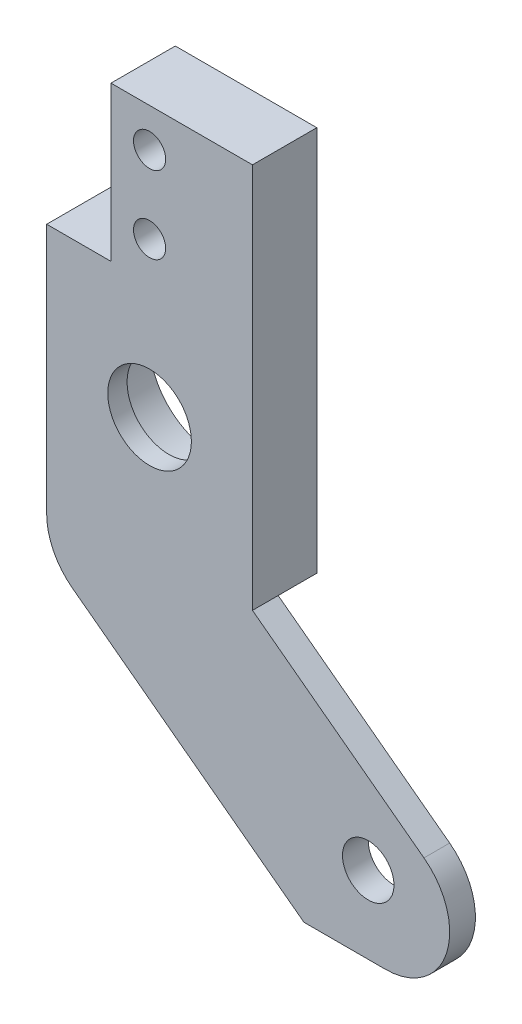
ISO-10303-21;
HEADER;
FILE_DESCRIPTION(('STEP AP214'),'2;1');
FILE_NAME('part.step','',(''),(''),'','','');
FILE_SCHEMA(('AUTOMOTIVE_DESIGN { 1 0 10303 214 1 1 1 1 }'));
ENDSEC;
DATA;
#1=APPLICATION_CONTEXT('core data for automotive mechanical design processes');
#2=APPLICATION_PROTOCOL_DEFINITION('international standard','automotive_design',2000,#1);
#3=PRODUCT_CONTEXT('',#1,'mechanical');
#4=PRODUCT('Part','Part','',(#3));
#5=PRODUCT_RELATED_PRODUCT_CATEGORY('part','',(#4));
#6=PRODUCT_DEFINITION_FORMATION('','',#4);
#7=PRODUCT_DEFINITION_CONTEXT('part definition',#1,'design');
#8=PRODUCT_DEFINITION('design','',#6,#7);
#9=PRODUCT_DEFINITION_SHAPE('','',#8);
#10=(LENGTH_UNIT() NAMED_UNIT(*) SI_UNIT(.MILLI.,.METRE.));
#11=(NAMED_UNIT(*) PLANE_ANGLE_UNIT() SI_UNIT($,.RADIAN.));
#12=(NAMED_UNIT(*) SI_UNIT($,.STERADIAN.) SOLID_ANGLE_UNIT());
#13=UNCERTAINTY_MEASURE_WITH_UNIT(LENGTH_MEASURE(1.E-05),#10,'distance_accuracy_value','');
#14=(GEOMETRIC_REPRESENTATION_CONTEXT(3) GLOBAL_UNCERTAINTY_ASSIGNED_CONTEXT((#13)) GLOBAL_UNIT_ASSIGNED_CONTEXT((#10,
#11,#12)) REPRESENTATION_CONTEXT('',''));
#15=CARTESIAN_POINT('',(0.,0.,0.));
#16=DIRECTION('',(0.,0.,1.));
#17=DIRECTION('',(1.,0.,0.));
#18=AXIS2_PLACEMENT_3D('',#15,#16,#17);
#19=CARTESIAN_POINT('',(8.,21.,5.));
#20=DIRECTION('',(-1.,0.,0.));
#21=DIRECTION('',(0.,-1.,0.));
#22=AXIS2_PLACEMENT_3D('',#19,#20,#21);
#23=PLANE('',#22);
#24=DIRECTION('',(0.,1.,0.));
#25=VECTOR('',#24,1.);
#26=CARTESIAN_POINT('',(8.,21.,0.));
#27=LINE('',#26,#25);
#28=CARTESIAN_POINT('',(8.00000000000001,-9.,0.));
#29=VERTEX_POINT('',#28);
#30=CARTESIAN_POINT('',(8.,21.,0.));
#31=VERTEX_POINT('',#30);
#32=EDGE_CURVE('E218',#29,#31,#27,.T.);
#33=ORIENTED_EDGE('',*,*,#32,.T.);
#34=DIRECTION('',(0.,0.,-1.));
#35=VECTOR('',#34,1.);
#36=CARTESIAN_POINT('',(8.,21.,5.));
#37=LINE('',#36,#35);
#38=CARTESIAN_POINT('',(8.,21.,5.));
#39=VERTEX_POINT('',#38);
#40=EDGE_CURVE('E144',#39,#31,#37,.T.);
#41=ORIENTED_EDGE('',*,*,#40,.F.);
#42=DIRECTION('',(0.,1.,0.));
#43=VECTOR('',#42,1.);
#44=CARTESIAN_POINT('',(8.,21.,5.));
#45=LINE('',#44,#43);
#46=CARTESIAN_POINT('',(8.00000000000001,-9.,5.));
#47=VERTEX_POINT('',#46);
#48=EDGE_CURVE('E221',#47,#39,#45,.T.);
#49=ORIENTED_EDGE('',*,*,#48,.F.);
#50=DIRECTION('',(0.,0.,-1.));
#51=VECTOR('',#50,1.);
#52=CARTESIAN_POINT('',(8.00000000000001,-9.,5.));
#53=LINE('',#52,#51);
#54=CARTESIAN_POINT('',(8.00000000000001,-9.,3.));
#55=VERTEX_POINT('',#54);
#56=EDGE_CURVE('E235',#47,#55,#53,.T.);
#57=ORIENTED_EDGE('',*,*,#56,.T.);
#58=DIRECTION('',(0.,0.,-1.));
#59=VECTOR('',#58,1.);
#60=CARTESIAN_POINT('',(8.00000000000001,-9.,3.));
#61=LINE('',#60,#59);
#62=EDGE_CURVE('E175',#55,#29,#61,.T.);
#63=ORIENTED_EDGE('',*,*,#62,.T.);
#64=EDGE_LOOP('',(#33,#41,#49,#57,#63));
#65=FACE_BOUND('',#64,.T.);
#66=ADVANCED_FACE('F34',(#65),#23,.F.);
#67=CARTESIAN_POINT('',(-8.,21.,5.));
#68=DIRECTION('',(0.,-1.,0.));
#69=DIRECTION('',(0.,0.,-1.));
#70=AXIS2_PLACEMENT_3D('',#67,#68,#69);
#71=PLANE('',#70);
#72=DIRECTION('',(-1.,0.,0.));
#73=VECTOR('',#72,1.);
#74=CARTESIAN_POINT('',(-8.,21.,0.));
#75=LINE('',#74,#73);
#76=CARTESIAN_POINT('',(-3.,21.,0.));
#77=VERTEX_POINT('',#76);
#78=EDGE_CURVE('E238',#31,#77,#75,.T.);
#79=ORIENTED_EDGE('',*,*,#78,.T.);
#80=DIRECTION('',(0.,0.,1.));
#81=VECTOR('',#80,1.);
#82=CARTESIAN_POINT('',(-3.,21.,-13.));
#83=LINE('',#82,#81);
#84=CARTESIAN_POINT('',(-3.,21.,5.));
#85=VERTEX_POINT('',#84);
#86=EDGE_CURVE('E196',#77,#85,#83,.T.);
#87=ORIENTED_EDGE('',*,*,#86,.T.);
#88=DIRECTION('',(-1.,0.,0.));
#89=VECTOR('',#88,1.);
#90=CARTESIAN_POINT('',(-8.,21.,5.));
#91=LINE('',#90,#89);
#92=EDGE_CURVE('E224',#39,#85,#91,.T.);
#93=ORIENTED_EDGE('',*,*,#92,.F.);
#94=ORIENTED_EDGE('',*,*,#40,.T.);
#95=EDGE_LOOP('',(#79,#87,#93,#94));
#96=FACE_BOUND('',#95,.T.);
#97=ADVANCED_FACE('F253',(#96),#71,.F.);
#98=CARTESIAN_POINT('',(-8.,-13.,5.));
#99=DIRECTION('',(1.,0.,0.));
#100=DIRECTION('',(0.,0.,-1.));
#101=AXIS2_PLACEMENT_3D('',#98,#99,#100);
#102=PLANE('',#101);
#103=DIRECTION('',(0.,-1.,0.));
#104=VECTOR('',#103,1.);
#105=CARTESIAN_POINT('',(-8.,-13.,0.));
#106=LINE('',#105,#104);
#107=CARTESIAN_POINT('',(-8.,9.,0.));
#108=VERTEX_POINT('',#107);
#109=CARTESIAN_POINT('',(-8.,-9.,0.));
#110=VERTEX_POINT('',#109);
#111=EDGE_CURVE('E225',#108,#110,#106,.T.);
#112=ORIENTED_EDGE('',*,*,#111,.T.);
#113=DIRECTION('',(0.,0.,-1.));
#114=VECTOR('',#113,1.);
#115=CARTESIAN_POINT('',(-8.,-9.,3.));
#116=LINE('',#115,#114);
#117=CARTESIAN_POINT('',(-8.,-9.,3.));
#118=VERTEX_POINT('',#117);
#119=EDGE_CURVE('E172',#118,#110,#116,.T.);
#120=ORIENTED_EDGE('',*,*,#119,.F.);
#121=DIRECTION('',(0.,1.,0.));
#122=VECTOR('',#121,1.);
#123=CARTESIAN_POINT('',(-8.,-9.,3.));
#124=LINE('',#123,#122);
#125=CARTESIAN_POINT('',(-8.,-10.5,3.));
#126=VERTEX_POINT('',#125);
#127=EDGE_CURVE('E165',#126,#118,#124,.T.);
#128=ORIENTED_EDGE('',*,*,#127,.F.);
#129=DIRECTION('',(0.,0.,-1.));
#130=VECTOR('',#129,1.);
#131=CARTESIAN_POINT('',(-8.,-10.5,5.));
#132=LINE('',#131,#130);
#133=CARTESIAN_POINT('',(-8.,-10.5,5.));
#134=VERTEX_POINT('',#133);
#135=EDGE_CURVE('E11',#126,#134,#132,.F.);
#136=ORIENTED_EDGE('',*,*,#135,.T.);
#137=DIRECTION('',(0.,-1.,0.));
#138=VECTOR('',#137,1.);
#139=CARTESIAN_POINT('',(-8.,-13.,5.));
#140=LINE('',#139,#138);
#141=CARTESIAN_POINT('',(-8.,9.,5.));
#142=VERTEX_POINT('',#141);
#143=EDGE_CURVE('E228',#142,#134,#140,.T.);
#144=ORIENTED_EDGE('',*,*,#143,.F.);
#145=DIRECTION('',(0.,0.,1.));
#146=VECTOR('',#145,1.);
#147=CARTESIAN_POINT('',(-8.,9.,-13.));
#148=LINE('',#147,#146);
#149=EDGE_CURVE('E201',#108,#142,#148,.T.);
#150=ORIENTED_EDGE('',*,*,#149,.F.);
#151=EDGE_LOOP('',(#112,#120,#128,#136,#144,#150));
#152=FACE_BOUND('',#151,.T.);
#153=ADVANCED_FACE('F266',(#152),#102,.F.);
#154=CARTESIAN_POINT('',(-8.,-13.,5.));
#155=DIRECTION('',(0.6,0.8,0.));
#156=DIRECTION('',(-0.8,0.6,0.));
#157=AXIS2_PLACEMENT_3D('',#154,#155,#156);
#158=PLANE('',#157);
#159=DIRECTION('',(0.,0.,-1.));
#160=VECTOR('',#159,1.);
#161=CARTESIAN_POINT('',(-6.,-14.5,5.));
#162=LINE('',#161,#160);
#163=CARTESIAN_POINT('',(-6.,-14.5,5.));
#164=VERTEX_POINT('',#163);
#165=CARTESIAN_POINT('',(-6.,-14.5,3.));
#166=VERTEX_POINT('',#165);
#167=EDGE_CURVE('E42',#164,#166,#162,.T.);
#168=ORIENTED_EDGE('',*,*,#167,.T.);
#169=DIRECTION('',(-0.8,0.6,0.));
#170=VECTOR('',#169,1.);
#171=CARTESIAN_POINT('',(-6.,-14.5,3.));
#172=LINE('',#171,#170);
#173=CARTESIAN_POINT('',(12.,-28.,3.));
#174=VERTEX_POINT('',#173);
#175=EDGE_CURVE('E49',#174,#166,#172,.T.);
#176=ORIENTED_EDGE('',*,*,#175,.F.);
#177=DIRECTION('',(0.,0.,-1.));
#178=VECTOR('',#177,1.);
#179=CARTESIAN_POINT('',(12.,-28.,5.));
#180=LINE('',#179,#178);
#181=CARTESIAN_POINT('',(12.,-28.,5.));
#182=VERTEX_POINT('',#181);
#183=EDGE_CURVE('E148',#182,#174,#180,.T.);
#184=ORIENTED_EDGE('',*,*,#183,.F.);
#185=DIRECTION('',(0.8,-0.6,0.));
#186=VECTOR('',#185,1.);
#187=CARTESIAN_POINT('',(-8.,-13.,5.));
#188=LINE('',#187,#186);
#189=EDGE_CURVE('E160',#164,#182,#188,.T.);
#190=ORIENTED_EDGE('',*,*,#189,.F.);
#191=EDGE_LOOP('',(#168,#176,#184,#190));
#192=FACE_BOUND('',#191,.T.);
#193=ADVANCED_FACE('F157',(#192),#158,.F.);
#194=CARTESIAN_POINT('',(12.,-28.,5.));
#195=DIRECTION('',(0.,1.,0.));
#196=DIRECTION('',(-1.,0.,0.));
#197=AXIS2_PLACEMENT_3D('',#194,#195,#196);
#198=PLANE('',#197);
#199=ORIENTED_EDGE('',*,*,#183,.T.);
#200=DIRECTION('',(-1.,0.,0.));
#201=VECTOR('',#200,1.);
#202=CARTESIAN_POINT('',(12.,-28.,3.));
#203=LINE('',#202,#201);
#204=CARTESIAN_POINT('',(18.3333333333333,-28.,3.));
#205=VERTEX_POINT('',#204);
#206=EDGE_CURVE('E139',#205,#174,#203,.T.);
#207=ORIENTED_EDGE('',*,*,#206,.F.);
#208=DIRECTION('',(0.,0.,-1.));
#209=VECTOR('',#208,1.);
#210=CARTESIAN_POINT('',(18.3333333333333,-28.,5.));
#211=LINE('',#210,#209);
#212=CARTESIAN_POINT('',(18.3333333333333,-28.,5.));
#213=VERTEX_POINT('',#212);
#214=EDGE_CURVE('E138',#205,#213,#211,.F.);
#215=ORIENTED_EDGE('',*,*,#214,.T.);
#216=DIRECTION('',(1.,0.,0.));
#217=VECTOR('',#216,1.);
#218=CARTESIAN_POINT('',(12.,-28.,5.));
#219=LINE('',#218,#217);
#220=EDGE_CURVE('E231',#182,#213,#219,.T.);
#221=ORIENTED_EDGE('',*,*,#220,.F.);
#222=EDGE_LOOP('',(#199,#207,#215,#221));
#223=FACE_BOUND('',#222,.T.);
#224=ADVANCED_FACE('F245',(#223),#198,.F.);
#225=CARTESIAN_POINT('',(33.3333333333334,-28.,5.));
#226=DIRECTION('',(-0.6,-0.8,0.));
#227=DIRECTION('',(0.8,-0.6,0.));
#228=AXIS2_PLACEMENT_3D('',#225,#226,#227);
#229=PLANE('',#228);
#230=DIRECTION('',(0.,0.,-1.));
#231=VECTOR('',#230,1.);
#232=CARTESIAN_POINT('',(21.3333333333333,-19.,5.));
#233=LINE('',#232,#231);
#234=CARTESIAN_POINT('',(21.3333333333333,-19.,5.));
#235=VERTEX_POINT('',#234);
#236=CARTESIAN_POINT('',(21.3333333333333,-19.,3.));
#237=VERTEX_POINT('',#236);
#238=EDGE_CURVE('E137',#235,#237,#233,.T.);
#239=ORIENTED_EDGE('',*,*,#238,.T.);
#240=DIRECTION('',(0.8,-0.6,0.));
#241=VECTOR('',#240,1.);
#242=CARTESIAN_POINT('',(21.3333333333333,-19.,3.));
#243=LINE('',#242,#241);
#244=EDGE_CURVE('E119',#55,#237,#243,.T.);
#245=ORIENTED_EDGE('',*,*,#244,.F.);
#246=ORIENTED_EDGE('',*,*,#56,.F.);
#247=DIRECTION('',(-0.8,0.6,0.));
#248=VECTOR('',#247,1.);
#249=CARTESIAN_POINT('',(33.3333333333334,-28.,5.));
#250=LINE('',#249,#248);
#251=EDGE_CURVE('E143',#235,#47,#250,.T.);
#252=ORIENTED_EDGE('',*,*,#251,.F.);
#253=EDGE_LOOP('',(#239,#245,#246,#252));
#254=FACE_BOUND('',#253,.T.);
#255=ADVANCED_FACE('F142',(#254),#229,.F.);
#256=CARTESIAN_POINT('',(8.00000000000001,-28.,5.));
#257=DIRECTION('',(0.,0.,1.));
#258=DIRECTION('',(1.,0.,0.));
#259=AXIS2_PLACEMENT_3D('',#256,#257,#258);
#260=PLANE('',#259);
#261=CARTESIAN_POINT('',(17.,-22.,5.));
#262=DIRECTION('',(0.,0.,1.));
#263=DIRECTION('',(1.,0.,0.));
#264=AXIS2_PLACEMENT_3D('',#261,#262,#263);
#265=CIRCLE('',#264,2.);
#266=CARTESIAN_POINT('',(19.,-22.,5.));
#267=VERTEX_POINT('',#266);
#268=EDGE_CURVE('E174',#267,#267,#265,.F.);
#269=ORIENTED_EDGE('',*,*,#268,.T.);
#270=EDGE_LOOP('',(#269));
#271=FACE_BOUND('',#270,.T.);
#272=CARTESIAN_POINT('',(0.,12.,5.));
#273=DIRECTION('',(0.,0.,1.));
#274=DIRECTION('',(1.,0.,0.));
#275=AXIS2_PLACEMENT_3D('',#272,#273,#274);
#276=CIRCLE('',#275,1.25);
#277=CARTESIAN_POINT('',(-1.25,12.,5.));
#278=VERTEX_POINT('',#277);
#279=EDGE_CURVE('E182',#278,#278,#276,.F.);
#280=ORIENTED_EDGE('',*,*,#279,.T.);
#281=EDGE_LOOP('',(#280));
#282=FACE_BOUND('',#281,.T.);
#283=CARTESIAN_POINT('',(0.,18.,5.));
#284=DIRECTION('',(0.,0.,1.));
#285=DIRECTION('',(1.,0.,0.));
#286=AXIS2_PLACEMENT_3D('',#283,#284,#285);
#287=CIRCLE('',#286,1.25);
#288=CARTESIAN_POINT('',(-1.25,18.,5.));
#289=VERTEX_POINT('',#288);
#290=EDGE_CURVE('E188',#289,#289,#287,.F.);
#291=ORIENTED_EDGE('',*,*,#290,.T.);
#292=EDGE_LOOP('',(#291));
#293=FACE_BOUND('',#292,.T.);
#294=ORIENTED_EDGE('',*,*,#220,.T.);
#295=CARTESIAN_POINT('',(18.3333333333333,-23.,5.));
#296=DIRECTION('',(0.,0.,1.));
#297=DIRECTION('',(1.,0.,0.));
#298=AXIS2_PLACEMENT_3D('',#295,#296,#297);
#299=CIRCLE('',#298,5.);
#300=EDGE_CURVE('E153',#213,#235,#299,.T.);
#301=ORIENTED_EDGE('',*,*,#300,.T.);
#302=ORIENTED_EDGE('',*,*,#251,.T.);
#303=ORIENTED_EDGE('',*,*,#48,.T.);
#304=ORIENTED_EDGE('',*,*,#92,.T.);
#305=DIRECTION('',(0.,1.,0.));
#306=VECTOR('',#305,1.);
#307=CARTESIAN_POINT('',(-3.,21.,5.));
#308=LINE('',#307,#306);
#309=CARTESIAN_POINT('',(-3.,9.,5.));
#310=VERTEX_POINT('',#309);
#311=EDGE_CURVE('E199',#310,#85,#308,.T.);
#312=ORIENTED_EDGE('',*,*,#311,.F.);
#313=DIRECTION('',(1.,0.,0.));
#314=VECTOR('',#313,1.);
#315=CARTESIAN_POINT('',(-8.,9.,5.));
#316=LINE('',#315,#314);
#317=EDGE_CURVE('E191',#142,#310,#316,.T.);
#318=ORIENTED_EDGE('',*,*,#317,.F.);
#319=ORIENTED_EDGE('',*,*,#143,.T.);
#320=CARTESIAN_POINT('',(-3.,-10.5,5.));
#321=DIRECTION('',(0.,0.,1.));
#322=DIRECTION('',(1.,0.,0.));
#323=AXIS2_PLACEMENT_3D('',#320,#321,#322);
#324=CIRCLE('',#323,5.);
#325=EDGE_CURVE('E57',#134,#164,#324,.T.);
#326=ORIENTED_EDGE('',*,*,#325,.T.);
#327=ORIENTED_EDGE('',*,*,#189,.T.);
#328=EDGE_LOOP('',(#294,#301,#302,#303,#304,#312,#318,#319,#326,#327));
#329=FACE_BOUND('',#328,.T.);
#330=CARTESIAN_POINT('',(0.,0.,5.));
#331=DIRECTION('',(0.,0.,1.));
#332=DIRECTION('',(1.,0.,0.));
#333=AXIS2_PLACEMENT_3D('',#330,#331,#332);
#334=CIRCLE('',#333,3.25);
#335=CARTESIAN_POINT('',(3.25,0.,5.));
#336=VERTEX_POINT('',#335);
#337=EDGE_CURVE('E211',#336,#336,#334,.F.);
#338=ORIENTED_EDGE('',*,*,#337,.T.);
#339=EDGE_LOOP('',(#338));
#340=FACE_BOUND('',#339,.T.);
#341=ADVANCED_FACE('F246',(#271,#282,#293,#329,#340),#260,.T.);
#342=CARTESIAN_POINT('',(8.00000000000001,-28.,0.));
#343=DIRECTION('',(0.,0.,1.));
#344=DIRECTION('',(1.,0.,0.));
#345=AXIS2_PLACEMENT_3D('',#342,#343,#344);
#346=PLANE('',#345);
#347=CARTESIAN_POINT('',(0.,12.,0.));
#348=DIRECTION('',(0.,0.,-1.));
#349=DIRECTION('',(-1.,0.,0.));
#350=AXIS2_PLACEMENT_3D('',#347,#348,#349);
#351=CIRCLE('',#350,1.25);
#352=CARTESIAN_POINT('',(-1.25,12.,0.));
#353=VERTEX_POINT('',#352);
#354=EDGE_CURVE('E178',#353,#353,#351,.T.);
#355=ORIENTED_EDGE('',*,*,#354,.F.);
#356=EDGE_LOOP('',(#355));
#357=FACE_BOUND('',#356,.T.);
#358=CARTESIAN_POINT('',(0.,18.,0.));
#359=DIRECTION('',(0.,0.,-1.));
#360=DIRECTION('',(-1.,0.,0.));
#361=AXIS2_PLACEMENT_3D('',#358,#359,#360);
#362=CIRCLE('',#361,1.25);
#363=CARTESIAN_POINT('',(-1.25,18.,0.));
#364=VERTEX_POINT('',#363);
#365=EDGE_CURVE('E185',#364,#364,#362,.T.);
#366=ORIENTED_EDGE('',*,*,#365,.F.);
#367=EDGE_LOOP('',(#366));
#368=FACE_BOUND('',#367,.T.);
#369=CARTESIAN_POINT('',(0.,0.,0.));
#370=DIRECTION('',(0.,0.,-1.));
#371=DIRECTION('',(-1.,0.,0.));
#372=AXIS2_PLACEMENT_3D('',#369,#370,#371);
#373=CIRCLE('',#372,5.);
#374=CARTESIAN_POINT('',(-5.,0.,0.));
#375=VERTEX_POINT('',#374);
#376=EDGE_CURVE('E214',#375,#375,#373,.T.);
#377=ORIENTED_EDGE('',*,*,#376,.F.);
#378=EDGE_LOOP('',(#377));
#379=FACE_BOUND('',#378,.T.);
#380=ORIENTED_EDGE('',*,*,#32,.F.);
#381=DIRECTION('',(1.,0.,0.));
#382=VECTOR('',#381,1.);
#383=CARTESIAN_POINT('',(8.00000000000001,-9.,0.));
#384=LINE('',#383,#382);
#385=EDGE_CURVE('E130',#110,#29,#384,.T.);
#386=ORIENTED_EDGE('',*,*,#385,.F.);
#387=ORIENTED_EDGE('',*,*,#111,.F.);
#388=DIRECTION('',(-1.,0.,0.));
#389=VECTOR('',#388,1.);
#390=CARTESIAN_POINT('',(-8.,9.,0.));
#391=LINE('',#390,#389);
#392=CARTESIAN_POINT('',(-3.,9.00000000000001,0.));
#393=VERTEX_POINT('',#392);
#394=EDGE_CURVE('E195',#393,#108,#391,.T.);
#395=ORIENTED_EDGE('',*,*,#394,.F.);
#396=DIRECTION('',(0.,-1.,0.));
#397=VECTOR('',#396,1.);
#398=CARTESIAN_POINT('',(-3.,21.,0.));
#399=LINE('',#398,#397);
#400=EDGE_CURVE('E192',#77,#393,#399,.T.);
#401=ORIENTED_EDGE('',*,*,#400,.F.);
#402=ORIENTED_EDGE('',*,*,#78,.F.);
#403=EDGE_LOOP('',(#380,#386,#387,#395,#401,#402));
#404=FACE_BOUND('',#403,.T.);
#405=ADVANCED_FACE('F270',(#357,#368,#379,#404),#346,.F.);
#406=CARTESIAN_POINT('',(0.,0.,3.5));
#407=DIRECTION('',(0.,0.,-1.));
#408=DIRECTION('',(-1.,0.,0.));
#409=AXIS2_PLACEMENT_3D('',#406,#407,#408);
#410=CYLINDRICAL_SURFACE('',#409,5.);
#411=CARTESIAN_POINT('',(0.,0.,3.5));
#412=DIRECTION('',(0.,0.,-1.));
#413=DIRECTION('',(-1.,0.,0.));
#414=AXIS2_PLACEMENT_3D('',#411,#412,#413);
#415=CIRCLE('',#414,5.);
#416=CARTESIAN_POINT('',(-5.,0.,3.5));
#417=VERTEX_POINT('',#416);
#418=EDGE_CURVE('E215',#417,#417,#415,.T.);
#419=ORIENTED_EDGE('',*,*,#418,.F.);
#420=EDGE_LOOP('',(#419));
#421=FACE_BOUND('',#420,.T.);
#422=ORIENTED_EDGE('',*,*,#376,.T.);
#423=EDGE_LOOP('',(#422));
#424=FACE_BOUND('',#423,.T.);
#425=ADVANCED_FACE('F315',(#421,#424),#410,.F.);
#426=CARTESIAN_POINT('',(0.,0.,3.5));
#427=DIRECTION('',(0.,0.,-1.));
#428=DIRECTION('',(-1.,0.,0.));
#429=AXIS2_PLACEMENT_3D('',#426,#427,#428);
#430=PLANE('',#429);
#431=CARTESIAN_POINT('',(0.,0.,3.5));
#432=DIRECTION('',(0.,0.,-1.));
#433=DIRECTION('',(-1.,0.,0.));
#434=AXIS2_PLACEMENT_3D('',#431,#432,#433);
#435=CIRCLE('',#434,3.25);
#436=CARTESIAN_POINT('',(-3.25,0.,3.5));
#437=VERTEX_POINT('',#436);
#438=EDGE_CURVE('E208',#437,#437,#435,.T.);
#439=ORIENTED_EDGE('',*,*,#438,.F.);
#440=EDGE_LOOP('',(#439));
#441=FACE_BOUND('',#440,.T.);
#442=ORIENTED_EDGE('',*,*,#418,.T.);
#443=EDGE_LOOP('',(#442));
#444=FACE_BOUND('',#443,.T.);
#445=ADVANCED_FACE('F311',(#441,#444),#430,.T.);
#446=CARTESIAN_POINT('',(0.,0.,14.1923881554251));
#447=DIRECTION('',(0.,0.,-1.));
#448=DIRECTION('',(-1.,0.,0.));
#449=AXIS2_PLACEMENT_3D('',#446,#447,#448);
#450=CYLINDRICAL_SURFACE('',#449,3.25);
#451=ORIENTED_EDGE('',*,*,#438,.T.);
#452=EDGE_LOOP('',(#451));
#453=FACE_BOUND('',#452,.T.);
#454=ORIENTED_EDGE('',*,*,#337,.F.);
#455=EDGE_LOOP('',(#454));
#456=FACE_BOUND('',#455,.T.);
#457=ADVANCED_FACE('F306',(#453,#456),#450,.F.);
#458=CARTESIAN_POINT('',(-3.,21.,-13.));
#459=DIRECTION('',(1.,0.,0.));
#460=DIRECTION('',(0.,1.,0.));
#461=AXIS2_PLACEMENT_3D('',#458,#459,#460);
#462=PLANE('',#461);
#463=ORIENTED_EDGE('',*,*,#400,.T.);
#464=DIRECTION('',(0.,0.,1.));
#465=VECTOR('',#464,1.);
#466=CARTESIAN_POINT('',(-3.,9.,-13.));
#467=LINE('',#466,#465);
#468=EDGE_CURVE('E204',#393,#310,#467,.T.);
#469=ORIENTED_EDGE('',*,*,#468,.T.);
#470=ORIENTED_EDGE('',*,*,#311,.T.);
#471=ORIENTED_EDGE('',*,*,#86,.F.);
#472=EDGE_LOOP('',(#463,#469,#470,#471));
#473=FACE_BOUND('',#472,.T.);
#474=ADVANCED_FACE('F258',(#473),#462,.F.);
#475=CARTESIAN_POINT('',(-8.,9.,-13.));
#476=DIRECTION('',(0.,-1.,0.));
#477=DIRECTION('',(0.,0.,-1.));
#478=AXIS2_PLACEMENT_3D('',#475,#476,#477);
#479=PLANE('',#478);
#480=ORIENTED_EDGE('',*,*,#394,.T.);
#481=ORIENTED_EDGE('',*,*,#149,.T.);
#482=ORIENTED_EDGE('',*,*,#317,.T.);
#483=ORIENTED_EDGE('',*,*,#468,.F.);
#484=EDGE_LOOP('',(#480,#481,#482,#483));
#485=FACE_BOUND('',#484,.T.);
#486=ADVANCED_FACE('F262',(#485),#479,.F.);
#487=CARTESIAN_POINT('',(0.,18.,8.53553390593274));
#488=DIRECTION('',(0.,0.,-1.));
#489=DIRECTION('',(-1.,0.,0.));
#490=AXIS2_PLACEMENT_3D('',#487,#488,#489);
#491=CYLINDRICAL_SURFACE('',#490,1.25);
#492=CARTESIAN_POINT('',(-1.25,18.,0.));
#493=CARTESIAN_POINT('',(-1.25,18.,0.0520833333333351));
#494=CARTESIAN_POINT('',(-1.25,18.,0.104166666666669));
#495=CARTESIAN_POINT('',(-1.25,18.,0.208333333333335));
#496=CARTESIAN_POINT('',(-1.25,18.,0.260416666666669));
#497=CARTESIAN_POINT('',(-1.25,18.,0.364583333333335));
#498=CARTESIAN_POINT('',(-1.25,18.,0.416666666666669));
#499=CARTESIAN_POINT('',(-1.25,18.,0.520833333333335));
#500=CARTESIAN_POINT('',(-1.25,18.,0.572916666666669));
#501=CARTESIAN_POINT('',(-1.25,18.,0.677083333333335));
#502=CARTESIAN_POINT('',(-1.25,18.,0.729166666666668));
#503=CARTESIAN_POINT('',(-1.25,18.,0.833333333333334));
#504=CARTESIAN_POINT('',(-1.25,18.,0.885416666666668));
#505=CARTESIAN_POINT('',(-1.25,18.,0.989583333333334));
#506=CARTESIAN_POINT('',(-1.25,18.,1.04166666666667));
#507=CARTESIAN_POINT('',(-1.25,18.,1.14583333333333));
#508=CARTESIAN_POINT('',(-1.25,18.,1.19791666666667));
#509=CARTESIAN_POINT('',(-1.25,18.,1.30208333333333));
#510=CARTESIAN_POINT('',(-1.25,18.,1.35416666666667));
#511=CARTESIAN_POINT('',(-1.25,18.,1.45833333333333));
#512=CARTESIAN_POINT('',(-1.25,18.,1.51041666666667));
#513=CARTESIAN_POINT('',(-1.25,18.,1.61458333333333));
#514=CARTESIAN_POINT('',(-1.25,18.,1.66666666666667));
#515=CARTESIAN_POINT('',(-1.25,18.,1.77083333333333));
#516=CARTESIAN_POINT('',(-1.25,18.,1.82291666666667));
#517=CARTESIAN_POINT('',(-1.25,18.,1.92708333333333));
#518=CARTESIAN_POINT('',(-1.25,18.,1.97916666666667));
#519=CARTESIAN_POINT('',(-1.25,18.,2.08333333333333));
#520=CARTESIAN_POINT('',(-1.25,18.,2.13541666666667));
#521=CARTESIAN_POINT('',(-1.25,18.,2.23958333333333));
#522=CARTESIAN_POINT('',(-1.25,18.,2.29166666666667));
#523=CARTESIAN_POINT('',(-1.25,18.,2.39583333333333));
#524=CARTESIAN_POINT('',(-1.25,18.,2.44791666666667));
#525=CARTESIAN_POINT('',(-1.25,18.,2.55208333333333));
#526=CARTESIAN_POINT('',(-1.25,18.,2.60416666666667));
#527=CARTESIAN_POINT('',(-1.25,18.,2.70833333333333));
#528=CARTESIAN_POINT('',(-1.25,18.,2.76041666666667));
#529=CARTESIAN_POINT('',(-1.25,18.,2.86458333333333));
#530=CARTESIAN_POINT('',(-1.25,18.,2.91666666666667));
#531=CARTESIAN_POINT('',(-1.25,18.,3.02083333333333));
#532=CARTESIAN_POINT('',(-1.25,18.,3.07291666666667));
#533=CARTESIAN_POINT('',(-1.25,18.,3.17708333333333));
#534=CARTESIAN_POINT('',(-1.25,18.,3.22916666666667));
#535=CARTESIAN_POINT('',(-1.25,18.,3.33333333333333));
#536=CARTESIAN_POINT('',(-1.25,18.,3.38541666666667));
#537=CARTESIAN_POINT('',(-1.25,18.,3.48958333333333));
#538=CARTESIAN_POINT('',(-1.25,18.,3.54166666666667));
#539=CARTESIAN_POINT('',(-1.25,18.,3.64583333333333));
#540=CARTESIAN_POINT('',(-1.25,18.,3.69791666666667));
#541=CARTESIAN_POINT('',(-1.25,18.,3.80208333333333));
#542=CARTESIAN_POINT('',(-1.25,18.,3.85416666666667));
#543=CARTESIAN_POINT('',(-1.25,18.,3.95833333333333));
#544=CARTESIAN_POINT('',(-1.25,18.,4.01041666666667));
#545=CARTESIAN_POINT('',(-1.25,18.,4.11458333333333));
#546=CARTESIAN_POINT('',(-1.25,18.,4.16666666666667));
#547=CARTESIAN_POINT('',(-1.25,18.,4.27083333333333));
#548=CARTESIAN_POINT('',(-1.25,18.,4.32291666666667));
#549=CARTESIAN_POINT('',(-1.25,18.,4.42708333333333));
#550=CARTESIAN_POINT('',(-1.25,18.,4.47916666666667));
#551=CARTESIAN_POINT('',(-1.25,18.,4.58333333333333));
#552=CARTESIAN_POINT('',(-1.25,18.,4.63541666666667));
#553=CARTESIAN_POINT('',(-1.25,18.,4.73958333333333));
#554=CARTESIAN_POINT('',(-1.25,18.,4.79166666666667));
#555=CARTESIAN_POINT('',(-1.25,18.,4.89583333333333));
#556=CARTESIAN_POINT('',(-1.25,18.,4.94791666666667));
#557=CARTESIAN_POINT('',(-1.25,18.,5.));
#558=B_SPLINE_CURVE_WITH_KNOTS('',3,(#492,#493,#494,#495,#496,#497,#498,#499,#500,#501,#502,
#503,#504,#505,#506,#507,#508,#509,#510,#511,#512,#513,#514,#515,#516,#517,#518,#519,#520,#521,
#522,#523,#524,#525,#526,#527,#528,#529,#530,#531,#532,#533,#534,#535,#536,#537,#538,#539,#540,
#541,#542,#543,#544,#545,#546,#547,#548,#549,#550,#551,#552,#553,#554,#555,#556,#557),
.UNSPECIFIED.,.F.,.F.,(4,2,2,2,2,2,2,2,2,2,2,2,2,2,2,2,2,2,2,2,2,2,2,2,2,2,2,2,2,2,2,2,4),(0.,
0.15625,0.3125,0.46875,0.625000000000001,0.781249999999999,0.937499999999999,1.09375,1.25,
1.40625,1.5625,1.71875,1.875,2.03125,2.1875,2.34375,2.5,2.65625,2.8125,2.96875,3.125,3.28125,
3.4375,3.59375,3.75,3.90625,4.0625,4.21875,4.375,4.53125,4.6875,4.84375,5.),.UNSPECIFIED.);
#559=EDGE_CURVE('BSEAM295',#364,#289,#558,.T.);
#560=ORIENTED_EDGE('',*,*,#365,.T.);
#561=ORIENTED_EDGE('',*,*,#290,.F.);
#562=ORIENTED_EDGE('',*,*,#559,.T.);
#563=ORIENTED_EDGE('',*,*,#559,.F.);
#564=EDGE_LOOP('',(#560,#562,#561,#563));
#565=FACE_BOUND('',#564,.T.);
#566=ADVANCED_FACE('F295',(#565),#491,.F.);
#567=CARTESIAN_POINT('',(0.,12.,8.53553390593274));
#568=DIRECTION('',(0.,0.,-1.));
#569=DIRECTION('',(-1.,0.,0.));
#570=AXIS2_PLACEMENT_3D('',#567,#568,#569);
#571=CYLINDRICAL_SURFACE('',#570,1.25);
#572=CARTESIAN_POINT('',(-1.25,12.,0.));
#573=CARTESIAN_POINT('',(-1.25,12.,0.0520833333333351));
#574=CARTESIAN_POINT('',(-1.25,12.,0.104166666666669));
#575=CARTESIAN_POINT('',(-1.25,12.,0.208333333333335));
#576=CARTESIAN_POINT('',(-1.25,12.,0.260416666666669));
#577=CARTESIAN_POINT('',(-1.25,12.,0.364583333333335));
#578=CARTESIAN_POINT('',(-1.25,12.,0.416666666666669));
#579=CARTESIAN_POINT('',(-1.25,12.,0.520833333333335));
#580=CARTESIAN_POINT('',(-1.25,12.,0.572916666666669));
#581=CARTESIAN_POINT('',(-1.25,12.,0.677083333333335));
#582=CARTESIAN_POINT('',(-1.25,12.,0.729166666666668));
#583=CARTESIAN_POINT('',(-1.25,12.,0.833333333333334));
#584=CARTESIAN_POINT('',(-1.25,12.,0.885416666666668));
#585=CARTESIAN_POINT('',(-1.25,12.,0.989583333333334));
#586=CARTESIAN_POINT('',(-1.25,12.,1.04166666666667));
#587=CARTESIAN_POINT('',(-1.25,12.,1.14583333333333));
#588=CARTESIAN_POINT('',(-1.25,12.,1.19791666666667));
#589=CARTESIAN_POINT('',(-1.25,12.,1.30208333333333));
#590=CARTESIAN_POINT('',(-1.25,12.,1.35416666666667));
#591=CARTESIAN_POINT('',(-1.25,12.,1.45833333333333));
#592=CARTESIAN_POINT('',(-1.25,12.,1.51041666666667));
#593=CARTESIAN_POINT('',(-1.25,12.,1.61458333333333));
#594=CARTESIAN_POINT('',(-1.25,12.,1.66666666666667));
#595=CARTESIAN_POINT('',(-1.25,12.,1.77083333333333));
#596=CARTESIAN_POINT('',(-1.25,12.,1.82291666666667));
#597=CARTESIAN_POINT('',(-1.25,12.,1.92708333333333));
#598=CARTESIAN_POINT('',(-1.25,12.,1.97916666666667));
#599=CARTESIAN_POINT('',(-1.25,12.,2.08333333333333));
#600=CARTESIAN_POINT('',(-1.25,12.,2.13541666666667));
#601=CARTESIAN_POINT('',(-1.25,12.,2.23958333333333));
#602=CARTESIAN_POINT('',(-1.25,12.,2.29166666666667));
#603=CARTESIAN_POINT('',(-1.25,12.,2.39583333333333));
#604=CARTESIAN_POINT('',(-1.25,12.,2.44791666666667));
#605=CARTESIAN_POINT('',(-1.25,12.,2.55208333333333));
#606=CARTESIAN_POINT('',(-1.25,12.,2.60416666666667));
#607=CARTESIAN_POINT('',(-1.25,12.,2.70833333333333));
#608=CARTESIAN_POINT('',(-1.25,12.,2.76041666666667));
#609=CARTESIAN_POINT('',(-1.25,12.,2.86458333333333));
#610=CARTESIAN_POINT('',(-1.25,12.,2.91666666666667));
#611=CARTESIAN_POINT('',(-1.25,12.,3.02083333333333));
#612=CARTESIAN_POINT('',(-1.25,12.,3.07291666666667));
#613=CARTESIAN_POINT('',(-1.25,12.,3.17708333333333));
#614=CARTESIAN_POINT('',(-1.25,12.,3.22916666666667));
#615=CARTESIAN_POINT('',(-1.25,12.,3.33333333333333));
#616=CARTESIAN_POINT('',(-1.25,12.,3.38541666666667));
#617=CARTESIAN_POINT('',(-1.25,12.,3.48958333333333));
#618=CARTESIAN_POINT('',(-1.25,12.,3.54166666666667));
#619=CARTESIAN_POINT('',(-1.25,12.,3.64583333333333));
#620=CARTESIAN_POINT('',(-1.25,12.,3.69791666666667));
#621=CARTESIAN_POINT('',(-1.25,12.,3.80208333333333));
#622=CARTESIAN_POINT('',(-1.25,12.,3.85416666666667));
#623=CARTESIAN_POINT('',(-1.25,12.,3.95833333333333));
#624=CARTESIAN_POINT('',(-1.25,12.,4.01041666666667));
#625=CARTESIAN_POINT('',(-1.25,12.,4.11458333333333));
#626=CARTESIAN_POINT('',(-1.25,12.,4.16666666666667));
#627=CARTESIAN_POINT('',(-1.25,12.,4.27083333333333));
#628=CARTESIAN_POINT('',(-1.25,12.,4.32291666666667));
#629=CARTESIAN_POINT('',(-1.25,12.,4.42708333333333));
#630=CARTESIAN_POINT('',(-1.25,12.,4.47916666666667));
#631=CARTESIAN_POINT('',(-1.25,12.,4.58333333333333));
#632=CARTESIAN_POINT('',(-1.25,12.,4.63541666666667));
#633=CARTESIAN_POINT('',(-1.25,12.,4.73958333333333));
#634=CARTESIAN_POINT('',(-1.25,12.,4.79166666666667));
#635=CARTESIAN_POINT('',(-1.25,12.,4.89583333333333));
#636=CARTESIAN_POINT('',(-1.25,12.,4.94791666666667));
#637=CARTESIAN_POINT('',(-1.25,12.,5.));
#638=B_SPLINE_CURVE_WITH_KNOTS('',3,(#572,#573,#574,#575,#576,#577,#578,#579,#580,#581,#582,
#583,#584,#585,#586,#587,#588,#589,#590,#591,#592,#593,#594,#595,#596,#597,#598,#599,#600,#601,
#602,#603,#604,#605,#606,#607,#608,#609,#610,#611,#612,#613,#614,#615,#616,#617,#618,#619,#620,
#621,#622,#623,#624,#625,#626,#627,#628,#629,#630,#631,#632,#633,#634,#635,#636,#637),
.UNSPECIFIED.,.F.,.F.,(4,2,2,2,2,2,2,2,2,2,2,2,2,2,2,2,2,2,2,2,2,2,2,2,2,2,2,2,2,2,2,2,4),(0.,
0.15625,0.3125,0.46875,0.625000000000001,0.781249999999999,0.937499999999999,1.09375,1.25,
1.40625,1.5625,1.71875,1.875,2.03125,2.1875,2.34375,2.5,2.65625,2.8125,2.96875,3.125,3.28125,
3.4375,3.59375,3.75,3.90625,4.0625,4.21875,4.375,4.53125,4.6875,4.84375,5.),.UNSPECIFIED.);
#639=EDGE_CURVE('BSEAM291',#353,#278,#638,.T.);
#640=ORIENTED_EDGE('',*,*,#354,.T.);
#641=ORIENTED_EDGE('',*,*,#279,.F.);
#642=ORIENTED_EDGE('',*,*,#639,.T.);
#643=ORIENTED_EDGE('',*,*,#639,.F.);
#644=EDGE_LOOP('',(#640,#642,#641,#643));
#645=FACE_BOUND('',#644,.T.);
#646=ADVANCED_FACE('F291',(#645),#571,.F.);
#647=CARTESIAN_POINT('',(18.3333333333333,-23.,5.));
#648=DIRECTION('',(0.,0.,-1.));
#649=DIRECTION('',(-1.,0.,0.));
#650=AXIS2_PLACEMENT_3D('',#647,#648,#649);
#651=CYLINDRICAL_SURFACE('',#650,5.);
#652=CARTESIAN_POINT('',(18.3333333333333,-23.,3.));
#653=DIRECTION('',(0.,0.,-1.));
#654=DIRECTION('',(1.,0.,0.));
#655=AXIS2_PLACEMENT_3D('',#652,#653,#654);
#656=CIRCLE('',#655,5.00000000000002);
#657=EDGE_CURVE('E122',#237,#205,#656,.T.);
#658=ORIENTED_EDGE('',*,*,#657,.F.);
#659=ORIENTED_EDGE('',*,*,#238,.F.);
#660=ORIENTED_EDGE('',*,*,#300,.F.);
#661=ORIENTED_EDGE('',*,*,#214,.F.);
#662=EDGE_LOOP('',(#658,#659,#660,#661));
#663=FACE_BOUND('',#662,.T.);
#664=ADVANCED_FACE('F135',(#663),#651,.T.);
#665=CARTESIAN_POINT('',(-3.,-10.5,5.));
#666=DIRECTION('',(0.,0.,-1.));
#667=DIRECTION('',(-1.,0.,0.));
#668=AXIS2_PLACEMENT_3D('',#665,#666,#667);
#669=CYLINDRICAL_SURFACE('',#668,5.);
#670=CARTESIAN_POINT('',(-3.,-10.5,3.));
#671=DIRECTION('',(0.,0.,-1.));
#672=DIRECTION('',(1.,0.,0.));
#673=AXIS2_PLACEMENT_3D('',#670,#671,#672);
#674=CIRCLE('',#673,5.);
#675=EDGE_CURVE('E163',#166,#126,#674,.T.);
#676=ORIENTED_EDGE('',*,*,#675,.F.);
#677=ORIENTED_EDGE('',*,*,#167,.F.);
#678=ORIENTED_EDGE('',*,*,#325,.F.);
#679=ORIENTED_EDGE('',*,*,#135,.F.);
#680=EDGE_LOOP('',(#676,#677,#678,#679));
#681=FACE_BOUND('',#680,.T.);
#682=ADVANCED_FACE('F36',(#681),#669,.T.);
#683=CARTESIAN_POINT('',(8.00000000000001,-9.,3.));
#684=DIRECTION('',(0.,1.,0.));
#685=DIRECTION('',(0.,0.,1.));
#686=AXIS2_PLACEMENT_3D('',#683,#684,#685);
#687=PLANE('',#686);
#688=ORIENTED_EDGE('',*,*,#385,.T.);
#689=ORIENTED_EDGE('',*,*,#62,.F.);
#690=DIRECTION('',(1.,0.,0.));
#691=VECTOR('',#690,1.);
#692=CARTESIAN_POINT('',(8.00000000000001,-9.,3.));
#693=LINE('',#692,#691);
#694=EDGE_CURVE('E125',#118,#55,#693,.T.);
#695=ORIENTED_EDGE('',*,*,#694,.F.);
#696=ORIENTED_EDGE('',*,*,#119,.T.);
#697=EDGE_LOOP('',(#688,#689,#695,#696));
#698=FACE_BOUND('',#697,.T.);
#699=ADVANCED_FACE('F272',(#698),#687,.F.);
#700=CARTESIAN_POINT('',(-3.,-10.5,3.));
#701=DIRECTION('',(0.,0.,1.));
#702=DIRECTION('',(1.,0.,0.));
#703=AXIS2_PLACEMENT_3D('',#700,#701,#702);
#704=PLANE('',#703);
#705=CARTESIAN_POINT('',(17.,-22.,3.));
#706=DIRECTION('',(0.,0.,-1.));
#707=DIRECTION('',(-1.,0.,0.));
#708=AXIS2_PLACEMENT_3D('',#705,#706,#707);
#709=CIRCLE('',#708,2.);
#710=CARTESIAN_POINT('',(15.,-22.,3.));
#711=VERTEX_POINT('',#710);
#712=EDGE_CURVE('E453',#711,#711,#709,.T.);
#713=ORIENTED_EDGE('',*,*,#712,.F.);
#714=EDGE_LOOP('',(#713));
#715=FACE_BOUND('',#714,.T.);
#716=ORIENTED_EDGE('',*,*,#244,.T.);
#717=ORIENTED_EDGE('',*,*,#657,.T.);
#718=ORIENTED_EDGE('',*,*,#206,.T.);
#719=ORIENTED_EDGE('',*,*,#175,.T.);
#720=ORIENTED_EDGE('',*,*,#675,.T.);
#721=ORIENTED_EDGE('',*,*,#127,.T.);
#722=ORIENTED_EDGE('',*,*,#694,.T.);
#723=EDGE_LOOP('',(#716,#717,#718,#719,#720,#721,#722));
#724=FACE_BOUND('',#723,.T.);
#725=ADVANCED_FACE('F121',(#715,#724),#704,.F.);
#726=CARTESIAN_POINT('',(17.,-22.,10.6568542494924));
#727=DIRECTION('',(0.,0.,-1.));
#728=DIRECTION('',(-1.,0.,0.));
#729=AXIS2_PLACEMENT_3D('',#726,#727,#728);
#730=CYLINDRICAL_SURFACE('',#729,2.);
#731=ORIENTED_EDGE('',*,*,#712,.T.);
#732=EDGE_LOOP('',(#731));
#733=FACE_BOUND('',#732,.T.);
#734=ORIENTED_EDGE('',*,*,#268,.F.);
#735=EDGE_LOOP('',(#734));
#736=FACE_BOUND('',#735,.T.);
#737=ADVANCED_FACE('F279',(#733,#736),#730,.F.);
#738=CLOSED_SHELL('',(#66,#97,#153,#193,#224,#255,#341,#405,#425,#445,#457,#474,#486,#566,#646,
#664,#682,#699,#725,#737));
#739=MANIFOLD_SOLID_BREP('B2',#738);
#740=ADVANCED_BREP_SHAPE_REPRESENTATION('',(#18,#739),#14);
#741=SHAPE_DEFINITION_REPRESENTATION(#9,#740);
ENDSEC;
END-ISO-10303-21;
